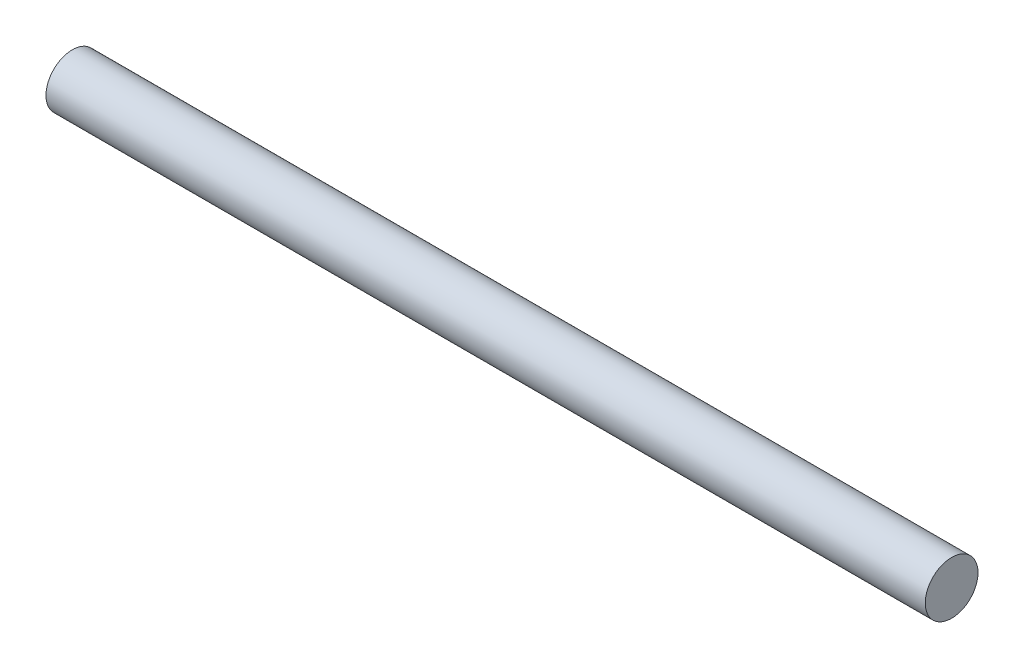
ISO-10303-21;
HEADER;
FILE_DESCRIPTION(('STEP AP214'),'2;1');
FILE_NAME('part.step','',(''),(''),'','','');
FILE_SCHEMA(('AUTOMOTIVE_DESIGN { 1 0 10303 214 1 1 1 1 }'));
ENDSEC;
DATA;
#1=APPLICATION_CONTEXT('core data for automotive mechanical design processes');
#2=APPLICATION_PROTOCOL_DEFINITION('international standard','automotive_design',2000,#1);
#3=PRODUCT_CONTEXT('',#1,'mechanical');
#4=PRODUCT('Part','Part','',(#3));
#5=PRODUCT_RELATED_PRODUCT_CATEGORY('part','',(#4));
#6=PRODUCT_DEFINITION_FORMATION('','',#4);
#7=PRODUCT_DEFINITION_CONTEXT('part definition',#1,'design');
#8=PRODUCT_DEFINITION('design','',#6,#7);
#9=PRODUCT_DEFINITION_SHAPE('','',#8);
#10=(LENGTH_UNIT() NAMED_UNIT(*) SI_UNIT(.MILLI.,.METRE.));
#11=(NAMED_UNIT(*) PLANE_ANGLE_UNIT() SI_UNIT($,.RADIAN.));
#12=(NAMED_UNIT(*) SI_UNIT($,.STERADIAN.) SOLID_ANGLE_UNIT());
#13=UNCERTAINTY_MEASURE_WITH_UNIT(LENGTH_MEASURE(1.E-05),#10,'distance_accuracy_value','');
#14=(GEOMETRIC_REPRESENTATION_CONTEXT(3) GLOBAL_UNCERTAINTY_ASSIGNED_CONTEXT((#13)) GLOBAL_UNIT_ASSIGNED_CONTEXT((#10,
#11,#12)) REPRESENTATION_CONTEXT('',''));
#15=CARTESIAN_POINT('',(0.,0.,0.));
#16=DIRECTION('',(0.,0.,1.));
#17=DIRECTION('',(1.,0.,0.));
#18=AXIS2_PLACEMENT_3D('',#15,#16,#17);
#19=CARTESIAN_POINT('',(10.,0.,0.));
#20=DIRECTION('',(-1.,0.,0.));
#21=DIRECTION('',(0.,0.,1.));
#22=AXIS2_PLACEMENT_3D('',#19,#20,#21);
#23=CYLINDRICAL_SURFACE('',#22,0.3);
#24=CARTESIAN_POINT('',(10.,0.,0.));
#25=DIRECTION('',(1.,0.,0.));
#26=DIRECTION('',(0.,0.,-1.));
#27=AXIS2_PLACEMENT_3D('',#24,#25,#26);
#28=CIRCLE('',#27,0.3);
#29=CARTESIAN_POINT('',(10.,0.,-0.3));
#30=VERTEX_POINT('',#29);
#31=EDGE_CURVE('E10',#30,#30,#28,.T.);
#32=ORIENTED_EDGE('',*,*,#31,.F.);
#33=EDGE_LOOP('',(#32));
#34=FACE_BOUND('',#33,.T.);
#35=CARTESIAN_POINT('',(0.,0.,0.));
#36=DIRECTION('',(1.,0.,0.));
#37=DIRECTION('',(0.,0.,-1.));
#38=AXIS2_PLACEMENT_3D('',#35,#36,#37);
#39=CIRCLE('',#38,0.3);
#40=CARTESIAN_POINT('',(0.,0.,-0.3));
#41=VERTEX_POINT('',#40);
#42=EDGE_CURVE('E34',#41,#41,#39,.T.);
#43=ORIENTED_EDGE('',*,*,#42,.T.);
#44=EDGE_LOOP('',(#43));
#45=FACE_BOUND('',#44,.T.);
#46=ADVANCED_FACE('F31',(#34,#45),#23,.T.);
#47=CARTESIAN_POINT('',(10.,0.,0.));
#48=DIRECTION('',(1.,0.,0.));
#49=DIRECTION('',(0.,0.,-1.));
#50=AXIS2_PLACEMENT_3D('',#47,#48,#49);
#51=PLANE('',#50);
#52=ORIENTED_EDGE('',*,*,#31,.T.);
#53=EDGE_LOOP('',(#52));
#54=FACE_BOUND('',#53,.T.);
#55=ADVANCED_FACE('F46',(#54),#51,.T.);
#56=CARTESIAN_POINT('',(0.,0.,0.));
#57=DIRECTION('',(1.,0.,0.));
#58=DIRECTION('',(0.,0.,-1.));
#59=AXIS2_PLACEMENT_3D('',#56,#57,#58);
#60=PLANE('',#59);
#61=ORIENTED_EDGE('',*,*,#42,.F.);
#62=EDGE_LOOP('',(#61));
#63=FACE_BOUND('',#62,.T.);
#64=ADVANCED_FACE('F44',(#63),#60,.F.);
#65=CLOSED_SHELL('',(#46,#55,#64));
#66=MANIFOLD_SOLID_BREP('B2',#65);
#67=ADVANCED_BREP_SHAPE_REPRESENTATION('',(#18,#66),#14);
#68=SHAPE_DEFINITION_REPRESENTATION(#9,#67);
ENDSEC;
END-ISO-10303-21;
